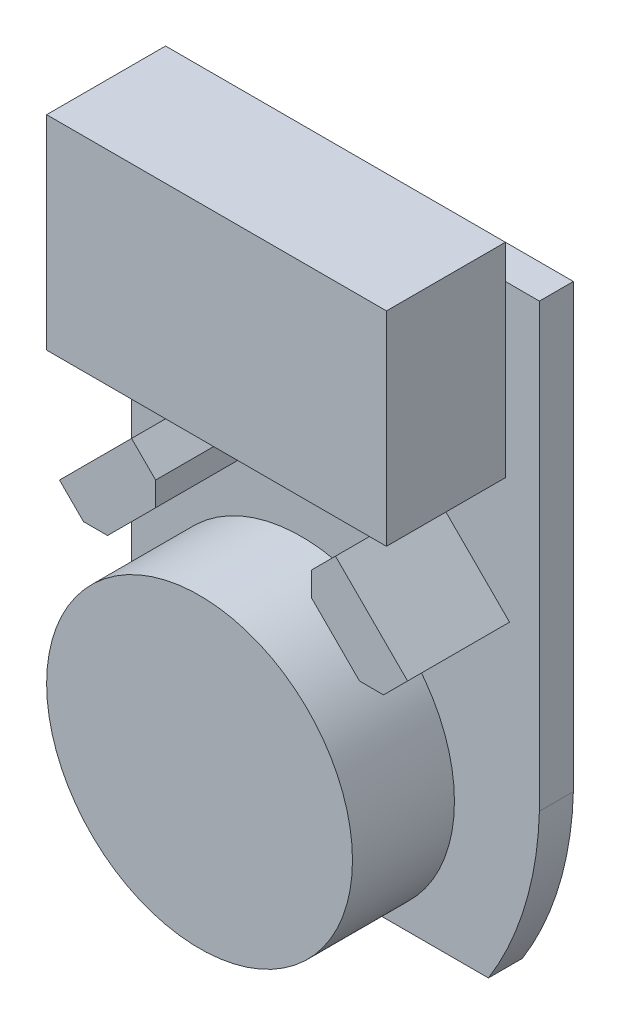
ISO-10303-21;
HEADER;
FILE_DESCRIPTION(('STEP AP214'),'2;1');
FILE_NAME('part.step','',(''),(''),'','','');
FILE_SCHEMA(('AUTOMOTIVE_DESIGN { 1 0 10303 214 1 1 1 1 }'));
ENDSEC;
DATA;
#1=APPLICATION_CONTEXT('core data for automotive mechanical design processes');
#2=APPLICATION_PROTOCOL_DEFINITION('international standard','automotive_design',2000,#1);
#3=PRODUCT_CONTEXT('',#1,'mechanical');
#4=PRODUCT('Part','Part','',(#3));
#5=PRODUCT_RELATED_PRODUCT_CATEGORY('part','',(#4));
#6=PRODUCT_DEFINITION_FORMATION('','',#4);
#7=PRODUCT_DEFINITION_CONTEXT('part definition',#1,'design');
#8=PRODUCT_DEFINITION('design','',#6,#7);
#9=PRODUCT_DEFINITION_SHAPE('','',#8);
#10=(LENGTH_UNIT() NAMED_UNIT(*) SI_UNIT(.MILLI.,.METRE.));
#11=(NAMED_UNIT(*) PLANE_ANGLE_UNIT() SI_UNIT($,.RADIAN.));
#12=(NAMED_UNIT(*) SI_UNIT($,.STERADIAN.) SOLID_ANGLE_UNIT());
#13=UNCERTAINTY_MEASURE_WITH_UNIT(LENGTH_MEASURE(1.E-05),#10,'distance_accuracy_value','');
#14=(GEOMETRIC_REPRESENTATION_CONTEXT(3) GLOBAL_UNCERTAINTY_ASSIGNED_CONTEXT((#13)) GLOBAL_UNIT_ASSIGNED_CONTEXT((#10,
#11,#12)) REPRESENTATION_CONTEXT('',''));
#15=CARTESIAN_POINT('',(0.,0.,0.));
#16=DIRECTION('',(0.,0.,1.));
#17=DIRECTION('',(1.,0.,0.));
#18=AXIS2_PLACEMENT_3D('',#15,#16,#17);
#19=CARTESIAN_POINT('',(3.99624892948784,0.273874678846352,1.));
#20=DIRECTION('',(0.,0.,1.));
#21=DIRECTION('',(1.,0.,0.));
#22=AXIS2_PLACEMENT_3D('',#19,#20,#21);
#23=PLANE('',#22);
#24=DIRECTION('',(-0.707106781186548,-0.707106781186547,0.));
#25=VECTOR('',#24,1.);
#26=CARTESIAN_POINT('',(4.41421356237309,3.67157287525381,1.));
#27=LINE('',#26,#25);
#28=CARTESIAN_POINT('',(5.12132034355964,4.37867965644036,1.));
#29=VERTEX_POINT('',#28);
#30=CARTESIAN_POINT('',(4.41421356237309,3.67157287525381,1.));
#31=VERTEX_POINT('',#30);
#32=EDGE_CURVE('E199',#29,#31,#27,.T.);
#33=ORIENTED_EDGE('',*,*,#32,.T.);
#34=DIRECTION('',(-1.,0.,0.));
#35=VECTOR('',#34,1.);
#36=CARTESIAN_POINT('',(3.70710678118655,3.67157287525381,1.));
#37=LINE('',#36,#35);
#38=CARTESIAN_POINT('',(3.70710678118655,3.67157287525381,1.));
#39=VERTEX_POINT('',#38);
#40=EDGE_CURVE('E216',#31,#39,#37,.T.);
#41=ORIENTED_EDGE('',*,*,#40,.T.);
#42=DIRECTION('',(-0.707106781186547,0.707106781186548,0.));
#43=VECTOR('',#42,1.);
#44=CARTESIAN_POINT('',(2.29289321881345,5.08578643762691,1.));
#45=LINE('',#44,#43);
#46=CARTESIAN_POINT('',(2.29289321881345,5.08578643762691,1.));
#47=VERTEX_POINT('',#46);
#48=EDGE_CURVE('E245',#39,#47,#45,.T.);
#49=ORIENTED_EDGE('',*,*,#48,.T.);
#50=DIRECTION('',(0.,1.,0.));
#51=VECTOR('',#50,1.);
#52=CARTESIAN_POINT('',(2.29289321881345,5.79289321881345,1.));
#53=LINE('',#52,#51);
#54=CARTESIAN_POINT('',(2.29289321881345,5.79289321881345,1.));
#55=VERTEX_POINT('',#54);
#56=EDGE_CURVE('E242',#47,#55,#53,.T.);
#57=ORIENTED_EDGE('',*,*,#56,.T.);
#58=DIRECTION('',(0.707106781186548,0.707106781186547,0.));
#59=VECTOR('',#58,1.);
#60=CARTESIAN_POINT('',(3.,6.5,1.));
#61=LINE('',#60,#59);
#62=CARTESIAN_POINT('',(3.,6.5,1.));
#63=VERTEX_POINT('',#62);
#64=EDGE_CURVE('E60',#55,#63,#61,.T.);
#65=ORIENTED_EDGE('',*,*,#64,.T.);
#66=DIRECTION('',(0.707106781186548,-0.707106781186547,0.));
#67=VECTOR('',#66,1.);
#68=CARTESIAN_POINT('',(5.12132034355964,4.37867965644036,1.));
#69=LINE('',#68,#67);
#70=EDGE_CURVE('E55',#63,#29,#69,.T.);
#71=ORIENTED_EDGE('',*,*,#70,.T.);
#72=EDGE_LOOP('',(#33,#41,#49,#57,#65,#71));
#73=FACE_BOUND('',#72,.T.);
#74=CARTESIAN_POINT('',(0.,0.,1.));
#75=DIRECTION('',(0.,0.,1.));
#76=DIRECTION('',(1.,0.,0.));
#77=AXIS2_PLACEMENT_3D('',#74,#75,#76);
#78=CIRCLE('',#77,0.5);
#79=CARTESIAN_POINT('',(0.5,0.,1.));
#80=VERTEX_POINT('',#79);
#81=EDGE_CURVE('E378',#80,#80,#78,.T.);
#82=ORIENTED_EDGE('',*,*,#81,.F.);
#83=EDGE_LOOP('',(#82));
#84=FACE_BOUND('',#83,.T.);
#85=DIRECTION('',(1.,0.,0.));
#86=VECTOR('',#85,1.);
#87=CARTESIAN_POINT('',(-6.,13.,1.));
#88=LINE('',#87,#86);
#89=CARTESIAN_POINT('',(5.,13.,1.));
#90=VERTEX_POINT('',#89);
#91=CARTESIAN_POINT('',(6.,13.,1.));
#92=VERTEX_POINT('',#91);
#93=EDGE_CURVE('E394',#90,#92,#88,.T.);
#94=ORIENTED_EDGE('',*,*,#93,.F.);
#95=DIRECTION('',(0.,1.,0.));
#96=VECTOR('',#95,1.);
#97=CARTESIAN_POINT('',(5.,0.273874678846352,1.));
#98=LINE('',#97,#96);
#99=CARTESIAN_POINT('',(5.,8.,1.));
#100=VERTEX_POINT('',#99);
#101=EDGE_CURVE('E344',#100,#90,#98,.T.);
#102=ORIENTED_EDGE('',*,*,#101,.F.);
#103=DIRECTION('',(-1.,0.,0.));
#104=VECTOR('',#103,1.);
#105=CARTESIAN_POINT('',(3.99624892948784,8.,1.));
#106=LINE('',#105,#104);
#107=CARTESIAN_POINT('',(-5.,8.,1.));
#108=VERTEX_POINT('',#107);
#109=EDGE_CURVE('E332',#100,#108,#106,.T.);
#110=ORIENTED_EDGE('',*,*,#109,.T.);
#111=DIRECTION('',(0.,1.,0.));
#112=VECTOR('',#111,1.);
#113=CARTESIAN_POINT('',(-5.,0.273874678846351,1.));
#114=LINE('',#113,#112);
#115=CARTESIAN_POINT('',(-5.,13.,1.));
#116=VERTEX_POINT('',#115);
#117=EDGE_CURVE('E353',#108,#116,#114,.T.);
#118=ORIENTED_EDGE('',*,*,#117,.T.);
#119=CARTESIAN_POINT('',(-6.,13.,1.));
#120=VERTEX_POINT('',#119);
#121=EDGE_CURVE('E396',#120,#116,#88,.T.);
#122=ORIENTED_EDGE('',*,*,#121,.F.);
#123=DIRECTION('',(0.,1.,0.));
#124=VECTOR('',#123,1.);
#125=CARTESIAN_POINT('',(-6.,0.,1.));
#126=LINE('',#125,#124);
#127=CARTESIAN_POINT('',(-6.,0.,1.));
#128=VERTEX_POINT('',#127);
#129=EDGE_CURVE('E400',#128,#120,#126,.T.);
#130=ORIENTED_EDGE('',*,*,#129,.F.);
#131=CARTESIAN_POINT('',(3.99624892948784,0.273874678846352,1.));
#132=DIRECTION('',(0.,0.,1.));
#133=DIRECTION('',(1.,0.,0.));
#134=AXIS2_PLACEMENT_3D('',#131,#132,#133);
#135=CIRCLE('',#134,10.);
#136=CARTESIAN_POINT('',(-4.5,-5.,1.));
#137=VERTEX_POINT('',#136);
#138=EDGE_CURVE('E405',#128,#137,#135,.T.);
#139=ORIENTED_EDGE('',*,*,#138,.T.);
#140=DIRECTION('',(1.,0.,0.));
#141=VECTOR('',#140,1.);
#142=CARTESIAN_POINT('',(-4.5,-5.,1.));
#143=LINE('',#142,#141);
#144=CARTESIAN_POINT('',(4.5,-5.,1.));
#145=VERTEX_POINT('',#144);
#146=EDGE_CURVE('E408',#137,#145,#143,.T.);
#147=ORIENTED_EDGE('',*,*,#146,.T.);
#148=CARTESIAN_POINT('',(-3.99624892948784,0.273874678846352,1.));
#149=DIRECTION('',(0.,0.,-1.));
#150=DIRECTION('',(-1.,0.,0.));
#151=AXIS2_PLACEMENT_3D('',#148,#149,#150);
#152=CIRCLE('',#151,10.);
#153=CARTESIAN_POINT('',(6.,0.,1.));
#154=VERTEX_POINT('',#153);
#155=EDGE_CURVE('E411',#154,#145,#152,.T.);
#156=ORIENTED_EDGE('',*,*,#155,.F.);
#157=DIRECTION('',(0.,1.,0.));
#158=VECTOR('',#157,1.);
#159=CARTESIAN_POINT('',(6.,0.,1.));
#160=LINE('',#159,#158);
#161=EDGE_CURVE('E390',#154,#92,#160,.T.);
#162=ORIENTED_EDGE('',*,*,#161,.T.);
#163=EDGE_LOOP('',(#94,#102,#110,#118,#122,#130,#139,#147,#156,#162));
#164=FACE_BOUND('',#163,.T.);
#165=DIRECTION('',(1.,0.,0.));
#166=VECTOR('',#165,1.);
#167=CARTESIAN_POINT('',(-3.70710678118655,3.67157287525381,1.));
#168=LINE('',#167,#166);
#169=CARTESIAN_POINT('',(-4.41421356237309,3.67157287525381,1.));
#170=VERTEX_POINT('',#169);
#171=CARTESIAN_POINT('',(-3.70710678118655,3.67157287525381,1.));
#172=VERTEX_POINT('',#171);
#173=EDGE_CURVE('E290',#170,#172,#168,.T.);
#174=ORIENTED_EDGE('',*,*,#173,.F.);
#175=DIRECTION('',(0.707106781186548,-0.707106781186547,0.));
#176=VECTOR('',#175,1.);
#177=CARTESIAN_POINT('',(-4.41421356237309,3.67157287525381,1.));
#178=LINE('',#177,#176);
#179=CARTESIAN_POINT('',(-5.12132034355964,4.37867965644036,1.));
#180=VERTEX_POINT('',#179);
#181=EDGE_CURVE('E203',#180,#170,#178,.T.);
#182=ORIENTED_EDGE('',*,*,#181,.F.);
#183=DIRECTION('',(-0.707106781186548,-0.707106781186547,0.));
#184=VECTOR('',#183,1.);
#185=CARTESIAN_POINT('',(-5.12132034355964,4.37867965644036,1.));
#186=LINE('',#185,#184);
#187=CARTESIAN_POINT('',(-3.,6.5,1.));
#188=VERTEX_POINT('',#187);
#189=EDGE_CURVE('E271',#188,#180,#186,.T.);
#190=ORIENTED_EDGE('',*,*,#189,.F.);
#191=DIRECTION('',(-0.707106781186548,0.707106781186547,0.));
#192=VECTOR('',#191,1.);
#193=CARTESIAN_POINT('',(-3.,6.5,1.));
#194=LINE('',#193,#192);
#195=CARTESIAN_POINT('',(-2.29289321881345,5.79289321881345,1.));
#196=VERTEX_POINT('',#195);
#197=EDGE_CURVE('E299',#196,#188,#194,.T.);
#198=ORIENTED_EDGE('',*,*,#197,.F.);
#199=DIRECTION('',(0.,1.,0.));
#200=VECTOR('',#199,1.);
#201=CARTESIAN_POINT('',(-2.29289321881345,5.79289321881345,1.));
#202=LINE('',#201,#200);
#203=CARTESIAN_POINT('',(-2.29289321881345,5.08578643762691,1.));
#204=VERTEX_POINT('',#203);
#205=EDGE_CURVE('E296',#204,#196,#202,.T.);
#206=ORIENTED_EDGE('',*,*,#205,.F.);
#207=DIRECTION('',(0.707106781186547,0.707106781186548,0.));
#208=VECTOR('',#207,1.);
#209=CARTESIAN_POINT('',(-2.29289321881345,5.08578643762691,1.));
#210=LINE('',#209,#208);
#211=EDGE_CURVE('E293',#172,#204,#210,.T.);
#212=ORIENTED_EDGE('',*,*,#211,.F.);
#213=EDGE_LOOP('',(#174,#182,#190,#198,#206,#212));
#214=FACE_BOUND('',#213,.T.);
#215=ADVANCED_FACE('F39',(#73,#84,#164,#214),#23,.T.);
#216=CARTESIAN_POINT('',(6.,0.,1.));
#217=DIRECTION('',(-1.,0.,0.));
#218=DIRECTION('',(0.,-1.,0.));
#219=AXIS2_PLACEMENT_3D('',#216,#217,#218);
#220=PLANE('',#219);
#221=DIRECTION('',(0.,1.,0.));
#222=VECTOR('',#221,1.);
#223=CARTESIAN_POINT('',(6.,0.,0.));
#224=LINE('',#223,#222);
#225=CARTESIAN_POINT('',(6.,0.,0.));
#226=VERTEX_POINT('',#225);
#227=CARTESIAN_POINT('',(6.,13.,0.));
#228=VERTEX_POINT('',#227);
#229=EDGE_CURVE('E386',#226,#228,#224,.T.);
#230=ORIENTED_EDGE('',*,*,#229,.T.);
#231=DIRECTION('',(0.,0.,-1.));
#232=VECTOR('',#231,1.);
#233=CARTESIAN_POINT('',(6.,13.,1.));
#234=LINE('',#233,#232);
#235=EDGE_CURVE('E11',#92,#228,#234,.T.);
#236=ORIENTED_EDGE('',*,*,#235,.F.);
#237=ORIENTED_EDGE('',*,*,#161,.F.);
#238=DIRECTION('',(0.,0.,-1.));
#239=VECTOR('',#238,1.);
#240=CARTESIAN_POINT('',(6.,0.,1.));
#241=LINE('',#240,#239);
#242=EDGE_CURVE('E415',#154,#226,#241,.T.);
#243=ORIENTED_EDGE('',*,*,#242,.T.);
#244=EDGE_LOOP('',(#230,#236,#237,#243));
#245=FACE_BOUND('',#244,.T.);
#246=ADVANCED_FACE('F41',(#245),#220,.F.);
#247=CARTESIAN_POINT('',(-6.,13.,1.));
#248=DIRECTION('',(0.,1.,0.));
#249=DIRECTION('',(0.,0.,1.));
#250=AXIS2_PLACEMENT_3D('',#247,#248,#249);
#251=PLANE('',#250);
#252=DIRECTION('',(1.,0.,0.));
#253=VECTOR('',#252,1.);
#254=CARTESIAN_POINT('',(-6.,13.,0.));
#255=LINE('',#254,#253);
#256=CARTESIAN_POINT('',(-6.,13.,0.));
#257=VERTEX_POINT('',#256);
#258=EDGE_CURVE('E419',#257,#228,#255,.T.);
#259=ORIENTED_EDGE('',*,*,#258,.F.);
#260=DIRECTION('',(0.,0.,-1.));
#261=VECTOR('',#260,1.);
#262=CARTESIAN_POINT('',(-6.,13.,1.));
#263=LINE('',#262,#261);
#264=EDGE_CURVE('E48',#120,#257,#263,.T.);
#265=ORIENTED_EDGE('',*,*,#264,.F.);
#266=ORIENTED_EDGE('',*,*,#121,.T.);
#267=EDGE_CURVE('E401',#116,#90,#88,.T.);
#268=ORIENTED_EDGE('',*,*,#267,.T.);
#269=ORIENTED_EDGE('',*,*,#93,.T.);
#270=ORIENTED_EDGE('',*,*,#235,.T.);
#271=EDGE_LOOP('',(#259,#265,#266,#268,#269,#270));
#272=FACE_BOUND('',#271,.T.);
#273=ADVANCED_FACE('F456',(#272),#251,.T.);
#274=CARTESIAN_POINT('',(-6.,0.,1.));
#275=DIRECTION('',(-1.,0.,0.));
#276=DIRECTION('',(0.,-1.,0.));
#277=AXIS2_PLACEMENT_3D('',#274,#275,#276);
#278=PLANE('',#277);
#279=DIRECTION('',(0.,1.,0.));
#280=VECTOR('',#279,1.);
#281=CARTESIAN_POINT('',(-6.,0.,0.));
#282=LINE('',#281,#280);
#283=CARTESIAN_POINT('',(-6.,0.,0.));
#284=VERTEX_POINT('',#283);
#285=EDGE_CURVE('E423',#284,#257,#282,.T.);
#286=ORIENTED_EDGE('',*,*,#285,.F.);
#287=DIRECTION('',(0.,0.,-1.));
#288=VECTOR('',#287,1.);
#289=CARTESIAN_POINT('',(-6.,0.,1.));
#290=LINE('',#289,#288);
#291=EDGE_CURVE('E446',#128,#284,#290,.T.);
#292=ORIENTED_EDGE('',*,*,#291,.F.);
#293=ORIENTED_EDGE('',*,*,#129,.T.);
#294=ORIENTED_EDGE('',*,*,#264,.T.);
#295=EDGE_LOOP('',(#286,#292,#293,#294));
#296=FACE_BOUND('',#295,.T.);
#297=ADVANCED_FACE('F452',(#296),#278,.T.);
#298=CARTESIAN_POINT('',(3.99624892948784,0.273874678846352,1.));
#299=DIRECTION('',(0.,0.,-1.));
#300=DIRECTION('',(-1.,0.,0.));
#301=AXIS2_PLACEMENT_3D('',#298,#299,#300);
#302=CYLINDRICAL_SURFACE('',#301,10.);
#303=CARTESIAN_POINT('',(3.99624892948784,0.273874678846352,0.));
#304=DIRECTION('',(0.,0.,1.));
#305=DIRECTION('',(1.,0.,0.));
#306=AXIS2_PLACEMENT_3D('',#303,#304,#305);
#307=CIRCLE('',#306,10.);
#308=CARTESIAN_POINT('',(-4.5,-5.,0.));
#309=VERTEX_POINT('',#308);
#310=EDGE_CURVE('E427',#284,#309,#307,.T.);
#311=ORIENTED_EDGE('',*,*,#310,.T.);
#312=DIRECTION('',(0.,0.,-1.));
#313=VECTOR('',#312,1.);
#314=CARTESIAN_POINT('',(-4.5,-5.,1.));
#315=LINE('',#314,#313);
#316=EDGE_CURVE('E442',#137,#309,#315,.T.);
#317=ORIENTED_EDGE('',*,*,#316,.F.);
#318=ORIENTED_EDGE('',*,*,#138,.F.);
#319=ORIENTED_EDGE('',*,*,#291,.T.);
#320=EDGE_LOOP('',(#311,#317,#318,#319));
#321=FACE_BOUND('',#320,.T.);
#322=ADVANCED_FACE('F465',(#321),#302,.T.);
#323=CARTESIAN_POINT('',(-4.5,-5.,1.));
#324=DIRECTION('',(0.,1.,0.));
#325=DIRECTION('',(0.,0.,1.));
#326=AXIS2_PLACEMENT_3D('',#323,#324,#325);
#327=PLANE('',#326);
#328=DIRECTION('',(1.,0.,0.));
#329=VECTOR('',#328,1.);
#330=CARTESIAN_POINT('',(-4.5,-5.,0.));
#331=LINE('',#330,#329);
#332=CARTESIAN_POINT('',(4.5,-5.,0.));
#333=VERTEX_POINT('',#332);
#334=EDGE_CURVE('E430',#309,#333,#331,.T.);
#335=ORIENTED_EDGE('',*,*,#334,.T.);
#336=DIRECTION('',(0.,0.,-1.));
#337=VECTOR('',#336,1.);
#338=CARTESIAN_POINT('',(4.5,-5.,1.));
#339=LINE('',#338,#337);
#340=EDGE_CURVE('E439',#145,#333,#339,.T.);
#341=ORIENTED_EDGE('',*,*,#340,.F.);
#342=ORIENTED_EDGE('',*,*,#146,.F.);
#343=ORIENTED_EDGE('',*,*,#316,.T.);
#344=EDGE_LOOP('',(#335,#341,#342,#343));
#345=FACE_BOUND('',#344,.T.);
#346=ADVANCED_FACE('F469',(#345),#327,.F.);
#347=CARTESIAN_POINT('',(-3.99624892948784,0.273874678846352,1.));
#348=DIRECTION('',(0.,0.,-1.));
#349=DIRECTION('',(-1.,0.,0.));
#350=AXIS2_PLACEMENT_3D('',#347,#348,#349);
#351=CYLINDRICAL_SURFACE('',#350,10.);
#352=CARTESIAN_POINT('',(-3.99624892948784,0.273874678846352,0.));
#353=DIRECTION('',(0.,0.,-1.));
#354=DIRECTION('',(-1.,0.,0.));
#355=AXIS2_PLACEMENT_3D('',#352,#353,#354);
#356=CIRCLE('',#355,10.);
#357=EDGE_CURVE('E395',#226,#333,#356,.T.);
#358=ORIENTED_EDGE('',*,*,#357,.F.);
#359=ORIENTED_EDGE('',*,*,#242,.F.);
#360=ORIENTED_EDGE('',*,*,#155,.T.);
#361=ORIENTED_EDGE('',*,*,#340,.T.);
#362=EDGE_LOOP('',(#358,#359,#360,#361));
#363=FACE_BOUND('',#362,.T.);
#364=ADVANCED_FACE('F506',(#363),#351,.T.);
#365=CARTESIAN_POINT('',(3.99624892948784,0.273874678846352,0.));
#366=DIRECTION('',(0.,0.,1.));
#367=DIRECTION('',(1.,0.,0.));
#368=AXIS2_PLACEMENT_3D('',#365,#366,#367);
#369=PLANE('',#368);
#370=ORIENTED_EDGE('',*,*,#229,.F.);
#371=ORIENTED_EDGE('',*,*,#357,.T.);
#372=ORIENTED_EDGE('',*,*,#334,.F.);
#373=ORIENTED_EDGE('',*,*,#310,.F.);
#374=ORIENTED_EDGE('',*,*,#285,.T.);
#375=ORIENTED_EDGE('',*,*,#258,.T.);
#376=EDGE_LOOP('',(#370,#371,#372,#373,#374,#375));
#377=FACE_BOUND('',#376,.T.);
#378=ADVANCED_FACE('F461',(#377),#369,.F.);
#379=CARTESIAN_POINT('',(0.,0.,2.));
#380=DIRECTION('',(0.,0.,-1.));
#381=DIRECTION('',(-1.,0.,0.));
#382=AXIS2_PLACEMENT_3D('',#379,#380,#381);
#383=CYLINDRICAL_SURFACE('',#382,0.5);
#384=CARTESIAN_POINT('',(0.,0.,2.));
#385=DIRECTION('',(0.,0.,1.));
#386=DIRECTION('',(1.,0.,0.));
#387=AXIS2_PLACEMENT_3D('',#384,#385,#386);
#388=CIRCLE('',#387,0.5);
#389=CARTESIAN_POINT('',(0.5,0.,2.));
#390=VERTEX_POINT('',#389);
#391=EDGE_CURVE('E382',#390,#390,#388,.T.);
#392=ORIENTED_EDGE('',*,*,#391,.F.);
#393=EDGE_LOOP('',(#392));
#394=FACE_BOUND('',#393,.T.);
#395=ORIENTED_EDGE('',*,*,#81,.T.);
#396=EDGE_LOOP('',(#395));
#397=FACE_BOUND('',#396,.T.);
#398=ADVANCED_FACE('F513',(#394,#397),#383,.T.);
#399=CARTESIAN_POINT('',(0.,0.,5.));
#400=DIRECTION('',(0.,0.,-1.));
#401=DIRECTION('',(-1.,0.,0.));
#402=AXIS2_PLACEMENT_3D('',#399,#400,#401);
#403=CYLINDRICAL_SURFACE('',#402,4.5);
#404=CARTESIAN_POINT('',(0.,0.,5.));
#405=DIRECTION('',(0.,0.,1.));
#406=DIRECTION('',(1.,0.,0.));
#407=AXIS2_PLACEMENT_3D('',#404,#405,#406);
#408=CIRCLE('',#407,4.5);
#409=CARTESIAN_POINT('',(4.5,0.,5.));
#410=VERTEX_POINT('',#409);
#411=EDGE_CURVE('E374',#410,#410,#408,.T.);
#412=ORIENTED_EDGE('',*,*,#411,.F.);
#413=EDGE_LOOP('',(#412));
#414=FACE_BOUND('',#413,.T.);
#415=CARTESIAN_POINT('',(0.,0.,2.));
#416=DIRECTION('',(0.,0.,1.));
#417=DIRECTION('',(1.,0.,0.));
#418=AXIS2_PLACEMENT_3D('',#415,#416,#417);
#419=CIRCLE('',#418,4.5);
#420=CARTESIAN_POINT('',(4.5,0.,2.));
#421=VERTEX_POINT('',#420);
#422=EDGE_CURVE('E373',#421,#421,#419,.T.);
#423=ORIENTED_EDGE('',*,*,#422,.T.);
#424=EDGE_LOOP('',(#423));
#425=FACE_BOUND('',#424,.T.);
#426=ADVANCED_FACE('F525',(#414,#425),#403,.T.);
#427=CARTESIAN_POINT('',(0.,0.,5.));
#428=DIRECTION('',(0.,0.,1.));
#429=DIRECTION('',(1.,0.,0.));
#430=AXIS2_PLACEMENT_3D('',#427,#428,#429);
#431=PLANE('',#430);
#432=ORIENTED_EDGE('',*,*,#411,.T.);
#433=EDGE_LOOP('',(#432));
#434=FACE_BOUND('',#433,.T.);
#435=ADVANCED_FACE('F529',(#434),#431,.T.);
#436=CARTESIAN_POINT('',(0.,0.,2.));
#437=DIRECTION('',(0.,0.,1.));
#438=DIRECTION('',(1.,0.,0.));
#439=AXIS2_PLACEMENT_3D('',#436,#437,#438);
#440=PLANE('',#439);
#441=ORIENTED_EDGE('',*,*,#391,.T.);
#442=EDGE_LOOP('',(#441));
#443=FACE_BOUND('',#442,.T.);
#444=ORIENTED_EDGE('',*,*,#422,.F.);
#445=EDGE_LOOP('',(#444));
#446=FACE_BOUND('',#445,.T.);
#447=ADVANCED_FACE('F531',(#443,#446),#440,.F.);
#448=CARTESIAN_POINT('',(5.,0.273874678846352,4.5));
#449=DIRECTION('',(-1.,0.,0.));
#450=DIRECTION('',(0.,0.,1.));
#451=AXIS2_PLACEMENT_3D('',#448,#449,#450);
#452=PLANE('',#451);
#453=ORIENTED_EDGE('',*,*,#101,.T.);
#454=CARTESIAN_POINT('',(5.,14.,1.));
#455=VERTEX_POINT('',#454);
#456=EDGE_CURVE('E326',#90,#455,#98,.T.);
#457=ORIENTED_EDGE('',*,*,#456,.T.);
#458=DIRECTION('',(0.,0.,-1.));
#459=VECTOR('',#458,1.);
#460=CARTESIAN_POINT('',(5.,14.,4.5));
#461=LINE('',#460,#459);
#462=CARTESIAN_POINT('',(5.,14.,4.5));
#463=VERTEX_POINT('',#462);
#464=EDGE_CURVE('E369',#463,#455,#461,.T.);
#465=ORIENTED_EDGE('',*,*,#464,.F.);
#466=DIRECTION('',(0.,1.,0.));
#467=VECTOR('',#466,1.);
#468=CARTESIAN_POINT('',(5.,0.273874678846352,4.5));
#469=LINE('',#468,#467);
#470=CARTESIAN_POINT('',(5.,8.,4.5));
#471=VERTEX_POINT('',#470);
#472=EDGE_CURVE('E327',#471,#463,#469,.T.);
#473=ORIENTED_EDGE('',*,*,#472,.F.);
#474=DIRECTION('',(0.,0.,-1.));
#475=VECTOR('',#474,1.);
#476=CARTESIAN_POINT('',(5.,8.,4.5));
#477=LINE('',#476,#475);
#478=EDGE_CURVE('E343',#471,#100,#477,.T.);
#479=ORIENTED_EDGE('',*,*,#478,.T.);
#480=EDGE_LOOP('',(#453,#457,#465,#473,#479));
#481=FACE_BOUND('',#480,.T.);
#482=ADVANCED_FACE('F490',(#481),#452,.F.);
#483=CARTESIAN_POINT('',(3.99624892948785,14.,4.5));
#484=DIRECTION('',(0.,-1.,0.));
#485=DIRECTION('',(1.,0.,0.));
#486=AXIS2_PLACEMENT_3D('',#483,#484,#485);
#487=PLANE('',#486);
#488=DIRECTION('',(-1.,0.,0.));
#489=VECTOR('',#488,1.);
#490=CARTESIAN_POINT('',(3.99624892948785,14.,1.));
#491=LINE('',#490,#489);
#492=CARTESIAN_POINT('',(-5.,14.,1.));
#493=VERTEX_POINT('',#492);
#494=EDGE_CURVE('E348',#455,#493,#491,.T.);
#495=ORIENTED_EDGE('',*,*,#494,.T.);
#496=DIRECTION('',(0.,0.,-1.));
#497=VECTOR('',#496,1.);
#498=CARTESIAN_POINT('',(-5.,14.,4.5));
#499=LINE('',#498,#497);
#500=CARTESIAN_POINT('',(-5.,14.,4.5));
#501=VERTEX_POINT('',#500);
#502=EDGE_CURVE('E365',#501,#493,#499,.T.);
#503=ORIENTED_EDGE('',*,*,#502,.F.);
#504=DIRECTION('',(-1.,0.,0.));
#505=VECTOR('',#504,1.);
#506=CARTESIAN_POINT('',(3.99624892948785,14.,4.5));
#507=LINE('',#506,#505);
#508=EDGE_CURVE('E331',#463,#501,#507,.T.);
#509=ORIENTED_EDGE('',*,*,#508,.F.);
#510=ORIENTED_EDGE('',*,*,#464,.T.);
#511=EDGE_LOOP('',(#495,#503,#509,#510));
#512=FACE_BOUND('',#511,.T.);
#513=ADVANCED_FACE('F493',(#512),#487,.F.);
#514=CARTESIAN_POINT('',(-5.,0.273874678846351,4.5));
#515=DIRECTION('',(-1.,0.,0.));
#516=DIRECTION('',(0.,-1.,0.));
#517=AXIS2_PLACEMENT_3D('',#514,#515,#516);
#518=PLANE('',#517);
#519=ORIENTED_EDGE('',*,*,#117,.F.);
#520=DIRECTION('',(0.,0.,-1.));
#521=VECTOR('',#520,1.);
#522=CARTESIAN_POINT('',(-5.,8.,4.5));
#523=LINE('',#522,#521);
#524=CARTESIAN_POINT('',(-5.,8.,4.5));
#525=VERTEX_POINT('',#524);
#526=EDGE_CURVE('E361',#525,#108,#523,.T.);
#527=ORIENTED_EDGE('',*,*,#526,.F.);
#528=DIRECTION('',(0.,1.,0.));
#529=VECTOR('',#528,1.);
#530=CARTESIAN_POINT('',(-5.,0.273874678846351,4.5));
#531=LINE('',#530,#529);
#532=EDGE_CURVE('E335',#525,#501,#531,.T.);
#533=ORIENTED_EDGE('',*,*,#532,.T.);
#534=ORIENTED_EDGE('',*,*,#502,.T.);
#535=EDGE_CURVE('E352',#116,#493,#114,.T.);
#536=ORIENTED_EDGE('',*,*,#535,.F.);
#537=EDGE_LOOP('',(#519,#527,#533,#534,#536));
#538=FACE_BOUND('',#537,.T.);
#539=ADVANCED_FACE('F484',(#538),#518,.T.);
#540=CARTESIAN_POINT('',(3.99624892948784,8.,4.5));
#541=DIRECTION('',(0.,-1.,0.));
#542=DIRECTION('',(0.,0.,-1.));
#543=AXIS2_PLACEMENT_3D('',#540,#541,#542);
#544=PLANE('',#543);
#545=ORIENTED_EDGE('',*,*,#109,.F.);
#546=ORIENTED_EDGE('',*,*,#478,.F.);
#547=DIRECTION('',(-1.,0.,0.));
#548=VECTOR('',#547,1.);
#549=CARTESIAN_POINT('',(3.99624892948784,8.,4.5));
#550=LINE('',#549,#548);
#551=EDGE_CURVE('E339',#471,#525,#550,.T.);
#552=ORIENTED_EDGE('',*,*,#551,.T.);
#553=ORIENTED_EDGE('',*,*,#526,.T.);
#554=EDGE_LOOP('',(#545,#546,#552,#553));
#555=FACE_BOUND('',#554,.T.);
#556=ADVANCED_FACE('F500',(#555),#544,.T.);
#557=CARTESIAN_POINT('',(0.,0.,4.5));
#558=DIRECTION('',(0.,0.,1.));
#559=DIRECTION('',(1.,0.,0.));
#560=AXIS2_PLACEMENT_3D('',#557,#558,#559);
#561=PLANE('',#560);
#562=ORIENTED_EDGE('',*,*,#472,.T.);
#563=ORIENTED_EDGE('',*,*,#508,.T.);
#564=ORIENTED_EDGE('',*,*,#532,.F.);
#565=ORIENTED_EDGE('',*,*,#551,.F.);
#566=EDGE_LOOP('',(#562,#563,#564,#565));
#567=FACE_BOUND('',#566,.T.);
#568=ADVANCED_FACE('F497',(#567),#561,.T.);
#569=CARTESIAN_POINT('',(0.,0.,1.));
#570=DIRECTION('',(0.,0.,1.));
#571=DIRECTION('',(1.,0.,0.));
#572=AXIS2_PLACEMENT_3D('',#569,#570,#571);
#573=PLANE('',#572);
#574=ORIENTED_EDGE('',*,*,#267,.F.);
#575=ORIENTED_EDGE('',*,*,#535,.T.);
#576=ORIENTED_EDGE('',*,*,#494,.F.);
#577=ORIENTED_EDGE('',*,*,#456,.F.);
#578=EDGE_LOOP('',(#574,#575,#576,#577));
#579=FACE_BOUND('',#578,.T.);
#580=ADVANCED_FACE('F480',(#579),#573,.F.);
#581=CARTESIAN_POINT('',(-4.41421356237309,3.67157287525381,4.));
#582=DIRECTION('',(0.707106781186547,0.707106781186548,0.));
#583=DIRECTION('',(-0.707106781186548,0.707106781186547,0.));
#584=AXIS2_PLACEMENT_3D('',#581,#582,#583);
#585=PLANE('',#584);
#586=ORIENTED_EDGE('',*,*,#181,.T.);
#587=DIRECTION('',(0.,0.,-1.));
#588=VECTOR('',#587,1.);
#589=CARTESIAN_POINT('',(-4.41421356237309,3.67157287525381,4.));
#590=LINE('',#589,#588);
#591=CARTESIAN_POINT('',(-4.41421356237309,3.67157287525381,4.));
#592=VERTEX_POINT('',#591);
#593=EDGE_CURVE('E323',#592,#170,#590,.T.);
#594=ORIENTED_EDGE('',*,*,#593,.F.);
#595=DIRECTION('',(0.707106781186548,-0.707106781186547,0.));
#596=VECTOR('',#595,1.);
#597=CARTESIAN_POINT('',(-4.41421356237309,3.67157287525381,4.));
#598=LINE('',#597,#596);
#599=CARTESIAN_POINT('',(-5.12132034355964,4.37867965644036,4.));
#600=VERTEX_POINT('',#599);
#601=EDGE_CURVE('E266',#600,#592,#598,.T.);
#602=ORIENTED_EDGE('',*,*,#601,.F.);
#603=DIRECTION('',(0.,0.,-1.));
#604=VECTOR('',#603,1.);
#605=CARTESIAN_POINT('',(-5.12132034355964,4.37867965644036,4.));
#606=LINE('',#605,#604);
#607=EDGE_CURVE('E286',#600,#180,#606,.T.);
#608=ORIENTED_EDGE('',*,*,#607,.T.);
#609=EDGE_LOOP('',(#586,#594,#602,#608));
#610=FACE_BOUND('',#609,.T.);
#611=ADVANCED_FACE('F548',(#610),#585,.F.);
#612=CARTESIAN_POINT('',(-3.70710678118655,3.67157287525381,4.));
#613=DIRECTION('',(0.,1.,0.));
#614=DIRECTION('',(0.,0.,1.));
#615=AXIS2_PLACEMENT_3D('',#612,#613,#614);
#616=PLANE('',#615);
#617=ORIENTED_EDGE('',*,*,#173,.T.);
#618=DIRECTION('',(0.,0.,-1.));
#619=VECTOR('',#618,1.);
#620=CARTESIAN_POINT('',(-3.70710678118655,3.67157287525381,4.));
#621=LINE('',#620,#619);
#622=CARTESIAN_POINT('',(-3.70710678118655,3.67157287525381,4.));
#623=VERTEX_POINT('',#622);
#624=EDGE_CURVE('E319',#623,#172,#621,.T.);
#625=ORIENTED_EDGE('',*,*,#624,.F.);
#626=DIRECTION('',(1.,0.,0.));
#627=VECTOR('',#626,1.);
#628=CARTESIAN_POINT('',(-3.70710678118655,3.67157287525381,4.));
#629=LINE('',#628,#627);
#630=EDGE_CURVE('E270',#592,#623,#629,.T.);
#631=ORIENTED_EDGE('',*,*,#630,.F.);
#632=ORIENTED_EDGE('',*,*,#593,.T.);
#633=EDGE_LOOP('',(#617,#625,#631,#632));
#634=FACE_BOUND('',#633,.T.);
#635=ADVANCED_FACE('F553',(#634),#616,.F.);
#636=CARTESIAN_POINT('',(-2.29289321881345,5.08578643762691,4.));
#637=DIRECTION('',(-0.707106781186548,0.707106781186547,0.));
#638=DIRECTION('',(-0.707106781186547,-0.707106781186548,0.));
#639=AXIS2_PLACEMENT_3D('',#636,#637,#638);
#640=PLANE('',#639);
#641=ORIENTED_EDGE('',*,*,#211,.T.);
#642=DIRECTION('',(0.,0.,-1.));
#643=VECTOR('',#642,1.);
#644=CARTESIAN_POINT('',(-2.29289321881345,5.08578643762691,4.));
#645=LINE('',#644,#643);
#646=CARTESIAN_POINT('',(-2.29289321881345,5.08578643762691,4.));
#647=VERTEX_POINT('',#646);
#648=EDGE_CURVE('E315',#647,#204,#645,.T.);
#649=ORIENTED_EDGE('',*,*,#648,.F.);
#650=DIRECTION('',(0.707106781186547,0.707106781186548,0.));
#651=VECTOR('',#650,1.);
#652=CARTESIAN_POINT('',(-2.29289321881345,5.08578643762691,4.));
#653=LINE('',#652,#651);
#654=EDGE_CURVE('E274',#623,#647,#653,.T.);
#655=ORIENTED_EDGE('',*,*,#654,.F.);
#656=ORIENTED_EDGE('',*,*,#624,.T.);
#657=EDGE_LOOP('',(#641,#649,#655,#656));
#658=FACE_BOUND('',#657,.T.);
#659=ADVANCED_FACE('F557',(#658),#640,.F.);
#660=CARTESIAN_POINT('',(-2.29289321881345,5.79289321881345,4.));
#661=DIRECTION('',(-1.,0.,0.));
#662=DIRECTION('',(0.,0.,1.));
#663=AXIS2_PLACEMENT_3D('',#660,#661,#662);
#664=PLANE('',#663);
#665=ORIENTED_EDGE('',*,*,#205,.T.);
#666=DIRECTION('',(0.,0.,-1.));
#667=VECTOR('',#666,1.);
#668=CARTESIAN_POINT('',(-2.29289321881345,5.79289321881345,4.));
#669=LINE('',#668,#667);
#670=CARTESIAN_POINT('',(-2.29289321881345,5.79289321881345,4.));
#671=VERTEX_POINT('',#670);
#672=EDGE_CURVE('E311',#671,#196,#669,.T.);
#673=ORIENTED_EDGE('',*,*,#672,.F.);
#674=DIRECTION('',(0.,1.,0.));
#675=VECTOR('',#674,1.);
#676=CARTESIAN_POINT('',(-2.29289321881345,5.79289321881345,4.));
#677=LINE('',#676,#675);
#678=EDGE_CURVE('E277',#647,#671,#677,.T.);
#679=ORIENTED_EDGE('',*,*,#678,.F.);
#680=ORIENTED_EDGE('',*,*,#648,.T.);
#681=EDGE_LOOP('',(#665,#673,#679,#680));
#682=FACE_BOUND('',#681,.T.);
#683=ADVANCED_FACE('F561',(#682),#664,.F.);
#684=CARTESIAN_POINT('',(-3.,6.5,4.));
#685=DIRECTION('',(-0.707106781186547,-0.707106781186548,0.));
#686=DIRECTION('',(0.707106781186548,-0.707106781186547,0.));
#687=AXIS2_PLACEMENT_3D('',#684,#685,#686);
#688=PLANE('',#687);
#689=ORIENTED_EDGE('',*,*,#197,.T.);
#690=DIRECTION('',(0.,0.,-1.));
#691=VECTOR('',#690,1.);
#692=CARTESIAN_POINT('',(-3.,6.5,4.));
#693=LINE('',#692,#691);
#694=CARTESIAN_POINT('',(-3.,6.5,4.));
#695=VERTEX_POINT('',#694);
#696=EDGE_CURVE('E308',#695,#188,#693,.T.);
#697=ORIENTED_EDGE('',*,*,#696,.F.);
#698=DIRECTION('',(-0.707106781186548,0.707106781186547,0.));
#699=VECTOR('',#698,1.);
#700=CARTESIAN_POINT('',(-3.,6.5,4.));
#701=LINE('',#700,#699);
#702=EDGE_CURVE('E280',#671,#695,#701,.T.);
#703=ORIENTED_EDGE('',*,*,#702,.F.);
#704=ORIENTED_EDGE('',*,*,#672,.T.);
#705=EDGE_LOOP('',(#689,#697,#703,#704));
#706=FACE_BOUND('',#705,.T.);
#707=ADVANCED_FACE('F565',(#706),#688,.F.);
#708=CARTESIAN_POINT('',(-5.12132034355964,4.37867965644036,4.));
#709=DIRECTION('',(0.707106781186547,-0.707106781186548,0.));
#710=DIRECTION('',(0.707106781186548,0.707106781186547,0.));
#711=AXIS2_PLACEMENT_3D('',#708,#709,#710);
#712=PLANE('',#711);
#713=ORIENTED_EDGE('',*,*,#189,.T.);
#714=ORIENTED_EDGE('',*,*,#607,.F.);
#715=DIRECTION('',(-0.707106781186548,-0.707106781186547,0.));
#716=VECTOR('',#715,1.);
#717=CARTESIAN_POINT('',(-5.12132034355964,4.37867965644036,4.));
#718=LINE('',#717,#716);
#719=EDGE_CURVE('E283',#695,#600,#718,.T.);
#720=ORIENTED_EDGE('',*,*,#719,.F.);
#721=ORIENTED_EDGE('',*,*,#696,.T.);
#722=EDGE_LOOP('',(#713,#714,#720,#721));
#723=FACE_BOUND('',#722,.T.);
#724=ADVANCED_FACE('F569',(#723),#712,.F.);
#725=CARTESIAN_POINT('',(0.,0.,4.));
#726=DIRECTION('',(0.,0.,-1.));
#727=DIRECTION('',(-1.,0.,0.));
#728=AXIS2_PLACEMENT_3D('',#725,#726,#727);
#729=PLANE('',#728);
#730=ORIENTED_EDGE('',*,*,#601,.T.);
#731=ORIENTED_EDGE('',*,*,#630,.T.);
#732=ORIENTED_EDGE('',*,*,#654,.T.);
#733=ORIENTED_EDGE('',*,*,#678,.T.);
#734=ORIENTED_EDGE('',*,*,#702,.T.);
#735=ORIENTED_EDGE('',*,*,#719,.T.);
#736=EDGE_LOOP('',(#730,#731,#732,#733,#734,#735));
#737=FACE_BOUND('',#736,.T.);
#738=ADVANCED_FACE('F573',(#737),#729,.F.);
#739=CARTESIAN_POINT('',(4.41421356237309,3.67157287525381,4.));
#740=DIRECTION('',(0.707106781186547,-0.707106781186548,0.));
#741=DIRECTION('',(0.707106781186548,0.707106781186547,0.));
#742=AXIS2_PLACEMENT_3D('',#739,#740,#741);
#743=PLANE('',#742);
#744=ORIENTED_EDGE('',*,*,#32,.F.);
#745=DIRECTION('',(0.,0.,-1.));
#746=VECTOR('',#745,1.);
#747=CARTESIAN_POINT('',(5.12132034355964,4.37867965644036,4.));
#748=LINE('',#747,#746);
#749=CARTESIAN_POINT('',(5.12132034355964,4.37867965644036,4.));
#750=VERTEX_POINT('',#749);
#751=EDGE_CURVE('E193',#750,#29,#748,.T.);
#752=ORIENTED_EDGE('',*,*,#751,.F.);
#753=DIRECTION('',(-0.707106781186548,-0.707106781186547,0.));
#754=VECTOR('',#753,1.);
#755=CARTESIAN_POINT('',(4.41421356237309,3.67157287525381,4.));
#756=LINE('',#755,#754);
#757=CARTESIAN_POINT('',(4.41421356237309,3.67157287525381,4.));
#758=VERTEX_POINT('',#757);
#759=EDGE_CURVE('E197',#750,#758,#756,.T.);
#760=ORIENTED_EDGE('',*,*,#759,.T.);
#761=DIRECTION('',(0.,0.,-1.));
#762=VECTOR('',#761,1.);
#763=CARTESIAN_POINT('',(4.41421356237309,3.67157287525381,4.));
#764=LINE('',#763,#762);
#765=EDGE_CURVE('E235',#758,#31,#764,.T.);
#766=ORIENTED_EDGE('',*,*,#765,.T.);
#767=EDGE_LOOP('',(#744,#752,#760,#766));
#768=FACE_BOUND('',#767,.T.);
#769=ADVANCED_FACE('F195',(#768),#743,.T.);
#770=CARTESIAN_POINT('',(5.12132034355964,4.37867965644036,4.));
#771=DIRECTION('',(0.707106781186547,0.707106781186548,0.));
#772=DIRECTION('',(-0.707106781186548,0.707106781186547,0.));
#773=AXIS2_PLACEMENT_3D('',#770,#771,#772);
#774=PLANE('',#773);
#775=ORIENTED_EDGE('',*,*,#70,.F.);
#776=DIRECTION('',(0.,0.,-1.));
#777=VECTOR('',#776,1.);
#778=CARTESIAN_POINT('',(3.,6.5,4.));
#779=LINE('',#778,#777);
#780=CARTESIAN_POINT('',(3.,6.5,4.));
#781=VERTEX_POINT('',#780);
#782=EDGE_CURVE('E204',#781,#63,#779,.T.);
#783=ORIENTED_EDGE('',*,*,#782,.F.);
#784=DIRECTION('',(0.707106781186548,-0.707106781186547,0.));
#785=VECTOR('',#784,1.);
#786=CARTESIAN_POINT('',(5.12132034355964,4.37867965644036,4.));
#787=LINE('',#786,#785);
#788=EDGE_CURVE('E210',#781,#750,#787,.T.);
#789=ORIENTED_EDGE('',*,*,#788,.T.);
#790=ORIENTED_EDGE('',*,*,#751,.T.);
#791=EDGE_LOOP('',(#775,#783,#789,#790));
#792=FACE_BOUND('',#791,.T.);
#793=ADVANCED_FACE('F218',(#792),#774,.T.);
#794=CARTESIAN_POINT('',(3.,6.5,4.));
#795=DIRECTION('',(-0.707106781186547,0.707106781186548,0.));
#796=DIRECTION('',(-0.707106781186548,-0.707106781186547,0.));
#797=AXIS2_PLACEMENT_3D('',#794,#795,#796);
#798=PLANE('',#797);
#799=ORIENTED_EDGE('',*,*,#64,.F.);
#800=DIRECTION('',(0.,0.,-1.));
#801=VECTOR('',#800,1.);
#802=CARTESIAN_POINT('',(2.29289321881345,5.79289321881345,4.));
#803=LINE('',#802,#801);
#804=CARTESIAN_POINT('',(2.29289321881345,5.79289321881345,4.));
#805=VERTEX_POINT('',#804);
#806=EDGE_CURVE('E260',#805,#55,#803,.T.);
#807=ORIENTED_EDGE('',*,*,#806,.F.);
#808=DIRECTION('',(0.707106781186548,0.707106781186547,0.));
#809=VECTOR('',#808,1.);
#810=CARTESIAN_POINT('',(3.,6.5,4.));
#811=LINE('',#810,#809);
#812=EDGE_CURVE('E220',#805,#781,#811,.T.);
#813=ORIENTED_EDGE('',*,*,#812,.T.);
#814=ORIENTED_EDGE('',*,*,#782,.T.);
#815=EDGE_LOOP('',(#799,#807,#813,#814));
#816=FACE_BOUND('',#815,.T.);
#817=ADVANCED_FACE('F582',(#816),#798,.T.);
#818=CARTESIAN_POINT('',(2.29289321881345,5.79289321881345,4.));
#819=DIRECTION('',(-1.,0.,0.));
#820=DIRECTION('',(0.,0.,1.));
#821=AXIS2_PLACEMENT_3D('',#818,#819,#820);
#822=PLANE('',#821);
#823=ORIENTED_EDGE('',*,*,#56,.F.);
#824=DIRECTION('',(0.,0.,-1.));
#825=VECTOR('',#824,1.);
#826=CARTESIAN_POINT('',(2.29289321881345,5.08578643762691,4.));
#827=LINE('',#826,#825);
#828=CARTESIAN_POINT('',(2.29289321881345,5.08578643762691,4.));
#829=VERTEX_POINT('',#828);
#830=EDGE_CURVE('E256',#829,#47,#827,.T.);
#831=ORIENTED_EDGE('',*,*,#830,.F.);
#832=DIRECTION('',(0.,1.,0.));
#833=VECTOR('',#832,1.);
#834=CARTESIAN_POINT('',(2.29289321881345,5.79289321881345,4.));
#835=LINE('',#834,#833);
#836=EDGE_CURVE('E223',#829,#805,#835,.T.);
#837=ORIENTED_EDGE('',*,*,#836,.T.);
#838=ORIENTED_EDGE('',*,*,#806,.T.);
#839=EDGE_LOOP('',(#823,#831,#837,#838));
#840=FACE_BOUND('',#839,.T.);
#841=ADVANCED_FACE('F585',(#840),#822,.T.);
#842=CARTESIAN_POINT('',(2.29289321881345,5.08578643762691,4.));
#843=DIRECTION('',(-0.707106781186548,-0.707106781186547,0.));
#844=DIRECTION('',(0.707106781186547,-0.707106781186548,0.));
#845=AXIS2_PLACEMENT_3D('',#842,#843,#844);
#846=PLANE('',#845);
#847=ORIENTED_EDGE('',*,*,#48,.F.);
#848=DIRECTION('',(0.,0.,-1.));
#849=VECTOR('',#848,1.);
#850=CARTESIAN_POINT('',(3.70710678118655,3.67157287525381,4.));
#851=LINE('',#850,#849);
#852=CARTESIAN_POINT('',(3.70710678118655,3.67157287525381,4.));
#853=VERTEX_POINT('',#852);
#854=EDGE_CURVE('E252',#853,#39,#851,.T.);
#855=ORIENTED_EDGE('',*,*,#854,.F.);
#856=DIRECTION('',(-0.707106781186547,0.707106781186548,0.));
#857=VECTOR('',#856,1.);
#858=CARTESIAN_POINT('',(2.29289321881345,5.08578643762691,4.));
#859=LINE('',#858,#857);
#860=EDGE_CURVE('E229',#853,#829,#859,.T.);
#861=ORIENTED_EDGE('',*,*,#860,.T.);
#862=ORIENTED_EDGE('',*,*,#830,.T.);
#863=EDGE_LOOP('',(#847,#855,#861,#862));
#864=FACE_BOUND('',#863,.T.);
#865=ADVANCED_FACE('F589',(#864),#846,.T.);
#866=CARTESIAN_POINT('',(3.70710678118655,3.67157287525381,4.));
#867=DIRECTION('',(0.,-1.,0.));
#868=DIRECTION('',(0.,0.,-1.));
#869=AXIS2_PLACEMENT_3D('',#866,#867,#868);
#870=PLANE('',#869);
#871=ORIENTED_EDGE('',*,*,#40,.F.);
#872=ORIENTED_EDGE('',*,*,#765,.F.);
#873=DIRECTION('',(-1.,0.,0.));
#874=VECTOR('',#873,1.);
#875=CARTESIAN_POINT('',(3.70710678118655,3.67157287525381,4.));
#876=LINE('',#875,#874);
#877=EDGE_CURVE('E214',#758,#853,#876,.T.);
#878=ORIENTED_EDGE('',*,*,#877,.T.);
#879=ORIENTED_EDGE('',*,*,#854,.T.);
#880=EDGE_LOOP('',(#871,#872,#878,#879));
#881=FACE_BOUND('',#880,.T.);
#882=ADVANCED_FACE('F593',(#881),#870,.T.);
#883=CARTESIAN_POINT('',(0.,0.,4.));
#884=DIRECTION('',(0.,0.,-1.));
#885=DIRECTION('',(1.,0.,0.));
#886=AXIS2_PLACEMENT_3D('',#883,#884,#885);
#887=PLANE('',#886);
#888=ORIENTED_EDGE('',*,*,#759,.F.);
#889=ORIENTED_EDGE('',*,*,#788,.F.);
#890=ORIENTED_EDGE('',*,*,#812,.F.);
#891=ORIENTED_EDGE('',*,*,#836,.F.);
#892=ORIENTED_EDGE('',*,*,#860,.F.);
#893=ORIENTED_EDGE('',*,*,#877,.F.);
#894=EDGE_LOOP('',(#888,#889,#890,#891,#892,#893));
#895=FACE_BOUND('',#894,.T.);
#896=ADVANCED_FACE('F208',(#895),#887,.F.);
#897=CLOSED_SHELL('',(#215,#246,#273,#297,#322,#346,#364,#378,#398,#426,#435,#447,#482,#513,
#539,#556,#568,#580,#611,#635,#659,#683,#707,#724,#738,#769,#793,#817,#841,#865,#882,#896));
#898=MANIFOLD_SOLID_BREP('B2',#897);
#899=ADVANCED_BREP_SHAPE_REPRESENTATION('',(#18,#898),#14);
#900=SHAPE_DEFINITION_REPRESENTATION(#9,#899);
ENDSEC;
END-ISO-10303-21;
